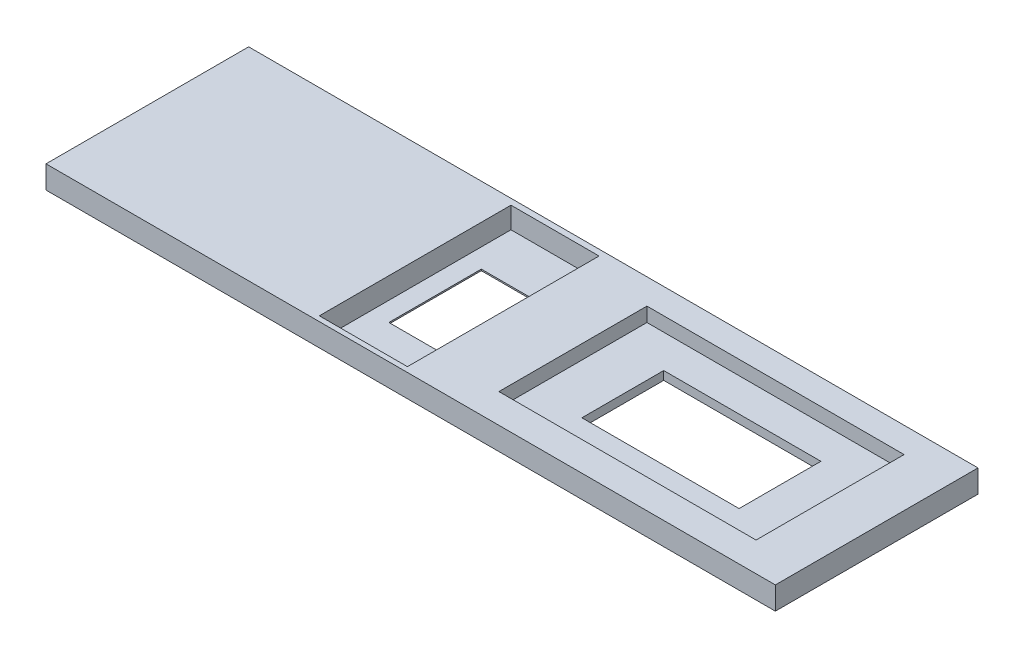
ISO-10303-21;
HEADER;
FILE_DESCRIPTION(('STEP AP214'),'2;1');
FILE_NAME('part.step','',(''),(''),'','','');
FILE_SCHEMA(('AUTOMOTIVE_DESIGN { 1 0 10303 214 1 1 1 1 }'));
ENDSEC;
DATA;
#1=APPLICATION_CONTEXT('core data for automotive mechanical design processes');
#2=APPLICATION_PROTOCOL_DEFINITION('international standard','automotive_design',2000,#1);
#3=PRODUCT_CONTEXT('',#1,'mechanical');
#4=PRODUCT('Part','Part','',(#3));
#5=PRODUCT_RELATED_PRODUCT_CATEGORY('part','',(#4));
#6=PRODUCT_DEFINITION_FORMATION('','',#4);
#7=PRODUCT_DEFINITION_CONTEXT('part definition',#1,'design');
#8=PRODUCT_DEFINITION('design','',#6,#7);
#9=PRODUCT_DEFINITION_SHAPE('','',#8);
#10=(LENGTH_UNIT() NAMED_UNIT(*) SI_UNIT(.MILLI.,.METRE.));
#11=(NAMED_UNIT(*) PLANE_ANGLE_UNIT() SI_UNIT($,.RADIAN.));
#12=(NAMED_UNIT(*) SI_UNIT($,.STERADIAN.) SOLID_ANGLE_UNIT());
#13=UNCERTAINTY_MEASURE_WITH_UNIT(LENGTH_MEASURE(1.E-05),#10,'distance_accuracy_value','');
#14=(GEOMETRIC_REPRESENTATION_CONTEXT(3) GLOBAL_UNCERTAINTY_ASSIGNED_CONTEXT((#13)) GLOBAL_UNIT_ASSIGNED_CONTEXT((#10,
#11,#12)) REPRESENTATION_CONTEXT('',''));
#15=CARTESIAN_POINT('',(0.,0.,0.));
#16=DIRECTION('',(0.,0.,1.));
#17=DIRECTION('',(1.,0.,0.));
#18=AXIS2_PLACEMENT_3D('',#15,#16,#17);
#19=CARTESIAN_POINT('',(0.,1.,0.));
#20=DIRECTION('',(0.,-1.,0.));
#21=DIRECTION('',(0.,0.,-1.));
#22=AXIS2_PLACEMENT_3D('',#19,#20,#21);
#23=PLANE('',#22);
#24=DIRECTION('',(-1.,0.,0.));
#25=VECTOR('',#24,1.);
#26=CARTESIAN_POINT('',(-5.82999999999999,1.,67.5299733079031));
#27=LINE('',#26,#25);
#28=CARTESIAN_POINT('',(-5.82999999999999,1.,67.5299733079031));
#29=VERTEX_POINT('',#28);
#30=CARTESIAN_POINT('',(-67.76,1.,67.5299733079031));
#31=VERTEX_POINT('',#30);
#32=EDGE_CURVE('E198',#29,#31,#27,.T.);
#33=ORIENTED_EDGE('',*,*,#32,.F.);
#34=DIRECTION('',(0.,0.,-1.));
#35=VECTOR('',#34,1.);
#36=CARTESIAN_POINT('',(-5.82999999999999,1.,67.5299733079031));
#37=LINE('',#36,#35);
#38=CARTESIAN_POINT('',(-5.82999999999999,1.,-67.2000266920968));
#39=VERTEX_POINT('',#38);
#40=EDGE_CURVE('E207',#29,#39,#37,.T.);
#41=ORIENTED_EDGE('',*,*,#40,.T.);
#42=DIRECTION('',(-1.,0.,0.));
#43=VECTOR('',#42,1.);
#44=CARTESIAN_POINT('',(-5.82999999999999,1.,-67.2000266920968));
#45=LINE('',#44,#43);
#46=CARTESIAN_POINT('',(-67.76,1.,-67.2000266920968));
#47=VERTEX_POINT('',#46);
#48=EDGE_CURVE('E204',#39,#47,#45,.T.);
#49=ORIENTED_EDGE('',*,*,#48,.T.);
#50=DIRECTION('',(0.,0.,-1.));
#51=VECTOR('',#50,1.);
#52=CARTESIAN_POINT('',(-67.76,1.,67.5299733079031));
#53=LINE('',#52,#51);
#54=EDGE_CURVE('E201',#31,#47,#53,.T.);
#55=ORIENTED_EDGE('',*,*,#54,.F.);
#56=EDGE_LOOP('',(#33,#41,#49,#55));
#57=FACE_BOUND('',#56,.T.);
#58=DIRECTION('',(0.,0.,-1.));
#59=VECTOR('',#58,1.);
#60=CARTESIAN_POINT('',(-19.26,1.,32.1507658849086));
#61=LINE('',#60,#59);
#62=CARTESIAN_POINT('',(-19.26,1.,32.1507658849086));
#63=VERTEX_POINT('',#62);
#64=CARTESIAN_POINT('',(-19.26,1.,-32.8492341150914));
#65=VERTEX_POINT('',#64);
#66=EDGE_CURVE('E181',#63,#65,#61,.T.);
#67=ORIENTED_EDGE('',*,*,#66,.F.);
#68=DIRECTION('',(1.,0.,0.));
#69=VECTOR('',#68,1.);
#70=CARTESIAN_POINT('',(-19.26,1.,32.1507658849086));
#71=LINE('',#70,#69);
#72=CARTESIAN_POINT('',(-54.26,1.,32.1507658849086));
#73=VERTEX_POINT('',#72);
#74=EDGE_CURVE('E178',#73,#63,#71,.T.);
#75=ORIENTED_EDGE('',*,*,#74,.F.);
#76=DIRECTION('',(0.,0.,1.));
#77=VECTOR('',#76,1.);
#78=CARTESIAN_POINT('',(-54.26,1.,32.1507658849086));
#79=LINE('',#78,#77);
#80=CARTESIAN_POINT('',(-54.26,1.,-32.8492341150914));
#81=VERTEX_POINT('',#80);
#82=EDGE_CURVE('E49',#81,#73,#79,.T.);
#83=ORIENTED_EDGE('',*,*,#82,.F.);
#84=DIRECTION('',(-1.,0.,0.));
#85=VECTOR('',#84,1.);
#86=CARTESIAN_POINT('',(-19.26,1.,-32.8492341150914));
#87=LINE('',#86,#85);
#88=EDGE_CURVE('E173',#65,#81,#87,.T.);
#89=ORIENTED_EDGE('',*,*,#88,.F.);
#90=EDGE_LOOP('',(#67,#75,#83,#89));
#91=FACE_BOUND('',#90,.T.);
#92=ADVANCED_FACE('F34',(#57,#91),#23,.F.);
#93=CARTESIAN_POINT('',(0.,16.,0.));
#94=DIRECTION('',(0.,-1.,0.));
#95=DIRECTION('',(0.,0.,-1.));
#96=AXIS2_PLACEMENT_3D('',#93,#94,#95);
#97=PLANE('',#96);
#98=DIRECTION('',(1.,0.,0.));
#99=VECTOR('',#98,1.);
#100=CARTESIAN_POINT('',(41.49,16.,-53.5399528951896));
#101=LINE('',#100,#99);
#102=CARTESIAN_POINT('',(41.49,16.,-53.5399528951896));
#103=VERTEX_POINT('',#102);
#104=CARTESIAN_POINT('',(222.3,16.,-53.5399528951896));
#105=VERTEX_POINT('',#104);
#106=EDGE_CURVE('E245',#103,#105,#101,.T.);
#107=ORIENTED_EDGE('',*,*,#106,.T.);
#108=DIRECTION('',(0.,0.,1.));
#109=VECTOR('',#108,1.);
#110=CARTESIAN_POINT('',(222.3,16.,-53.5399528951896));
#111=LINE('',#110,#109);
#112=CARTESIAN_POINT('',(222.3,16.,50.5400471048104));
#113=VERTEX_POINT('',#112);
#114=EDGE_CURVE('E268',#105,#113,#111,.T.);
#115=ORIENTED_EDGE('',*,*,#114,.T.);
#116=DIRECTION('',(1.,0.,0.));
#117=VECTOR('',#116,1.);
#118=CARTESIAN_POINT('',(41.49,16.,50.5400471048104));
#119=LINE('',#118,#117);
#120=CARTESIAN_POINT('',(41.49,16.,50.5400471048104));
#121=VERTEX_POINT('',#120);
#122=EDGE_CURVE('E271',#121,#113,#119,.T.);
#123=ORIENTED_EDGE('',*,*,#122,.F.);
#124=DIRECTION('',(0.,0.,1.));
#125=VECTOR('',#124,1.);
#126=CARTESIAN_POINT('',(41.49,16.,-53.5399528951896));
#127=LINE('',#126,#125);
#128=EDGE_CURVE('E257',#103,#121,#127,.T.);
#129=ORIENTED_EDGE('',*,*,#128,.F.);
#130=EDGE_LOOP('',(#107,#115,#123,#129));
#131=FACE_BOUND('',#130,.T.);
#132=DIRECTION('',(1.,0.,0.));
#133=VECTOR('',#132,1.);
#134=CARTESIAN_POINT('',(-256.4,16.,-71.4));
#135=LINE('',#134,#133);
#136=CARTESIAN_POINT('',(-256.4,16.,-71.4));
#137=VERTEX_POINT('',#136);
#138=CARTESIAN_POINT('',(256.4,16.,-71.4));
#139=VERTEX_POINT('',#138);
#140=EDGE_CURVE('E286',#137,#139,#135,.T.);
#141=ORIENTED_EDGE('',*,*,#140,.F.);
#142=DIRECTION('',(0.,0.,1.));
#143=VECTOR('',#142,1.);
#144=CARTESIAN_POINT('',(-256.4,16.,-71.4));
#145=LINE('',#144,#143);
#146=CARTESIAN_POINT('',(-256.4,16.,71.08));
#147=VERTEX_POINT('',#146);
#148=EDGE_CURVE('E295',#137,#147,#145,.T.);
#149=ORIENTED_EDGE('',*,*,#148,.T.);
#150=DIRECTION('',(1.,0.,0.));
#151=VECTOR('',#150,1.);
#152=CARTESIAN_POINT('',(-256.4,16.,71.08));
#153=LINE('',#152,#151);
#154=CARTESIAN_POINT('',(256.4,16.,71.08));
#155=VERTEX_POINT('',#154);
#156=EDGE_CURVE('E293',#147,#155,#153,.T.);
#157=ORIENTED_EDGE('',*,*,#156,.T.);
#158=DIRECTION('',(0.,0.,1.));
#159=VECTOR('',#158,1.);
#160=CARTESIAN_POINT('',(256.4,16.,-71.4));
#161=LINE('',#160,#159);
#162=EDGE_CURVE('E289',#139,#155,#161,.T.);
#163=ORIENTED_EDGE('',*,*,#162,.F.);
#164=EDGE_LOOP('',(#141,#149,#157,#163));
#165=FACE_BOUND('',#164,.T.);
#166=DIRECTION('',(-1.,0.,0.));
#167=VECTOR('',#166,1.);
#168=CARTESIAN_POINT('',(-5.82999999999999,16.,67.5299733079031));
#169=LINE('',#168,#167);
#170=CARTESIAN_POINT('',(-5.82999999999999,16.,67.5299733079031));
#171=VERTEX_POINT('',#170);
#172=CARTESIAN_POINT('',(-67.76,16.,67.5299733079031));
#173=VERTEX_POINT('',#172);
#174=EDGE_CURVE('E194',#171,#173,#169,.T.);
#175=ORIENTED_EDGE('',*,*,#174,.T.);
#176=DIRECTION('',(0.,0.,-1.));
#177=VECTOR('',#176,1.);
#178=CARTESIAN_POINT('',(-67.76,16.,67.5299733079031));
#179=LINE('',#178,#177);
#180=CARTESIAN_POINT('',(-67.76,16.,-67.2000266920968));
#181=VERTEX_POINT('',#180);
#182=EDGE_CURVE('E213',#173,#181,#179,.T.);
#183=ORIENTED_EDGE('',*,*,#182,.T.);
#184=DIRECTION('',(-1.,0.,0.));
#185=VECTOR('',#184,1.);
#186=CARTESIAN_POINT('',(-5.82999999999999,16.,-67.2000266920968));
#187=LINE('',#186,#185);
#188=CARTESIAN_POINT('',(-5.82999999999999,16.,-67.2000266920968));
#189=VERTEX_POINT('',#188);
#190=EDGE_CURVE('E216',#189,#181,#187,.T.);
#191=ORIENTED_EDGE('',*,*,#190,.F.);
#192=DIRECTION('',(0.,0.,-1.));
#193=VECTOR('',#192,1.);
#194=CARTESIAN_POINT('',(-5.82999999999999,16.,67.5299733079031));
#195=LINE('',#194,#193);
#196=EDGE_CURVE('E202',#171,#189,#195,.T.);
#197=ORIENTED_EDGE('',*,*,#196,.F.);
#198=EDGE_LOOP('',(#175,#183,#191,#197));
#199=FACE_BOUND('',#198,.T.);
#200=ADVANCED_FACE('F359',(#131,#165,#199),#97,.F.);
#201=CARTESIAN_POINT('',(-256.4,16.,-71.4));
#202=DIRECTION('',(0.,0.,-1.));
#203=DIRECTION('',(-1.,0.,0.));
#204=AXIS2_PLACEMENT_3D('',#201,#202,#203);
#205=PLANE('',#204);
#206=DIRECTION('',(1.,0.,0.));
#207=VECTOR('',#206,1.);
#208=CARTESIAN_POINT('',(-256.4,0.,-71.4));
#209=LINE('',#208,#207);
#210=CARTESIAN_POINT('',(-256.4,0.,-71.4));
#211=VERTEX_POINT('',#210);
#212=CARTESIAN_POINT('',(256.4,0.,-71.4));
#213=VERTEX_POINT('',#212);
#214=EDGE_CURVE('E285',#211,#213,#209,.T.);
#215=ORIENTED_EDGE('',*,*,#214,.F.);
#216=DIRECTION('',(0.,-1.,0.));
#217=VECTOR('',#216,1.);
#218=CARTESIAN_POINT('',(-256.4,16.,-71.4));
#219=LINE('',#218,#217);
#220=EDGE_CURVE('E307',#137,#211,#219,.T.);
#221=ORIENTED_EDGE('',*,*,#220,.F.);
#222=ORIENTED_EDGE('',*,*,#140,.T.);
#223=DIRECTION('',(0.,-1.,0.));
#224=VECTOR('',#223,1.);
#225=CARTESIAN_POINT('',(256.4,16.,-71.4));
#226=LINE('',#225,#224);
#227=EDGE_CURVE('E297',#139,#213,#226,.T.);
#228=ORIENTED_EDGE('',*,*,#227,.T.);
#229=EDGE_LOOP('',(#215,#221,#222,#228));
#230=FACE_BOUND('',#229,.T.);
#231=ADVANCED_FACE('F36',(#230),#205,.T.);
#232=CARTESIAN_POINT('',(-256.4,16.,-71.4));
#233=DIRECTION('',(1.,0.,0.));
#234=DIRECTION('',(0.,0.,-1.));
#235=AXIS2_PLACEMENT_3D('',#232,#233,#234);
#236=PLANE('',#235);
#237=DIRECTION('',(0.,0.,1.));
#238=VECTOR('',#237,1.);
#239=CARTESIAN_POINT('',(-256.4,0.,-71.4));
#240=LINE('',#239,#238);
#241=CARTESIAN_POINT('',(-256.4,0.,71.08));
#242=VERTEX_POINT('',#241);
#243=EDGE_CURVE('E290',#211,#242,#240,.T.);
#244=ORIENTED_EDGE('',*,*,#243,.T.);
#245=DIRECTION('',(0.,-1.,0.));
#246=VECTOR('',#245,1.);
#247=CARTESIAN_POINT('',(-256.4,16.,71.08));
#248=LINE('',#247,#246);
#249=EDGE_CURVE('E310',#147,#242,#248,.T.);
#250=ORIENTED_EDGE('',*,*,#249,.F.);
#251=ORIENTED_EDGE('',*,*,#148,.F.);
#252=ORIENTED_EDGE('',*,*,#220,.T.);
#253=EDGE_LOOP('',(#244,#250,#251,#252));
#254=FACE_BOUND('',#253,.T.);
#255=ADVANCED_FACE('F357',(#254),#236,.F.);
#256=CARTESIAN_POINT('',(-256.4,16.,71.08));
#257=DIRECTION('',(0.,0.,-1.));
#258=DIRECTION('',(-1.,0.,0.));
#259=AXIS2_PLACEMENT_3D('',#256,#257,#258);
#260=PLANE('',#259);
#261=DIRECTION('',(1.,0.,0.));
#262=VECTOR('',#261,1.);
#263=CARTESIAN_POINT('',(-256.4,0.,71.08));
#264=LINE('',#263,#262);
#265=CARTESIAN_POINT('',(256.4,0.,71.08));
#266=VERTEX_POINT('',#265);
#267=EDGE_CURVE('E303',#242,#266,#264,.T.);
#268=ORIENTED_EDGE('',*,*,#267,.T.);
#269=DIRECTION('',(0.,-1.,0.));
#270=VECTOR('',#269,1.);
#271=CARTESIAN_POINT('',(256.4,16.,71.08));
#272=LINE('',#271,#270);
#273=EDGE_CURVE('E313',#155,#266,#272,.T.);
#274=ORIENTED_EDGE('',*,*,#273,.F.);
#275=ORIENTED_EDGE('',*,*,#156,.F.);
#276=ORIENTED_EDGE('',*,*,#249,.T.);
#277=EDGE_LOOP('',(#268,#274,#275,#276));
#278=FACE_BOUND('',#277,.T.);
#279=ADVANCED_FACE('F354',(#278),#260,.F.);
#280=CARTESIAN_POINT('',(256.4,16.,-71.4));
#281=DIRECTION('',(1.,0.,0.));
#282=DIRECTION('',(0.,0.,-1.));
#283=AXIS2_PLACEMENT_3D('',#280,#281,#282);
#284=PLANE('',#283);
#285=DIRECTION('',(0.,0.,1.));
#286=VECTOR('',#285,1.);
#287=CARTESIAN_POINT('',(256.4,0.,-71.4));
#288=LINE('',#287,#286);
#289=EDGE_CURVE('E300',#213,#266,#288,.T.);
#290=ORIENTED_EDGE('',*,*,#289,.F.);
#291=ORIENTED_EDGE('',*,*,#227,.F.);
#292=ORIENTED_EDGE('',*,*,#162,.T.);
#293=ORIENTED_EDGE('',*,*,#273,.T.);
#294=EDGE_LOOP('',(#290,#291,#292,#293));
#295=FACE_BOUND('',#294,.T.);
#296=ADVANCED_FACE('F337',(#295),#284,.T.);
#297=CARTESIAN_POINT('',(0.,0.,0.));
#298=DIRECTION('',(0.,-1.,0.));
#299=DIRECTION('',(0.,0.,-1.));
#300=AXIS2_PLACEMENT_3D('',#297,#298,#299);
#301=PLANE('',#300);
#302=DIRECTION('',(0.,0.,1.));
#303=VECTOR('',#302,1.);
#304=CARTESIAN_POINT('',(-19.26,0.,0.));
#305=LINE('',#304,#303);
#306=CARTESIAN_POINT('',(-19.26,0.,-32.8492341150914));
#307=VERTEX_POINT('',#306);
#308=CARTESIAN_POINT('',(-19.26,0.,32.1507658849086));
#309=VERTEX_POINT('',#308);
#310=EDGE_CURVE('E11',#307,#309,#305,.T.);
#311=ORIENTED_EDGE('',*,*,#310,.F.);
#312=DIRECTION('',(1.,0.,0.));
#313=VECTOR('',#312,1.);
#314=CARTESIAN_POINT('',(0.,0.,-32.8492341150914));
#315=LINE('',#314,#313);
#316=CARTESIAN_POINT('',(-54.26,0.,-32.8492341150914));
#317=VERTEX_POINT('',#316);
#318=EDGE_CURVE('E175',#317,#307,#315,.T.);
#319=ORIENTED_EDGE('',*,*,#318,.F.);
#320=DIRECTION('',(0.,0.,-1.));
#321=VECTOR('',#320,1.);
#322=CARTESIAN_POINT('',(-54.26,0.,0.));
#323=LINE('',#322,#321);
#324=CARTESIAN_POINT('',(-54.26,0.,32.1507658849086));
#325=VERTEX_POINT('',#324);
#326=EDGE_CURVE('E326',#325,#317,#323,.T.);
#327=ORIENTED_EDGE('',*,*,#326,.F.);
#328=DIRECTION('',(-1.,0.,0.));
#329=VECTOR('',#328,1.);
#330=CARTESIAN_POINT('',(0.,0.,32.1507658849086));
#331=LINE('',#330,#329);
#332=EDGE_CURVE('E42',#309,#325,#331,.T.);
#333=ORIENTED_EDGE('',*,*,#332,.F.);
#334=EDGE_LOOP('',(#311,#319,#327,#333));
#335=FACE_BOUND('',#334,.T.);
#336=DIRECTION('',(0.,0.,1.));
#337=VECTOR('',#336,1.);
#338=CARTESIAN_POINT('',(76.625,0.,-30.1999528951896));
#339=LINE('',#338,#337);
#340=CARTESIAN_POINT('',(76.625,0.,-30.1999528951896));
#341=VERTEX_POINT('',#340);
#342=CARTESIAN_POINT('',(76.625,0.,27.3400471048104));
#343=VERTEX_POINT('',#342);
#344=EDGE_CURVE('E230',#341,#343,#339,.T.);
#345=ORIENTED_EDGE('',*,*,#344,.T.);
#346=DIRECTION('',(1.,0.,0.));
#347=VECTOR('',#346,1.);
#348=CARTESIAN_POINT('',(76.625,0.,27.3400471048104));
#349=LINE('',#348,#347);
#350=CARTESIAN_POINT('',(187.165,0.,27.3400471048104));
#351=VERTEX_POINT('',#350);
#352=EDGE_CURVE('E233',#343,#351,#349,.T.);
#353=ORIENTED_EDGE('',*,*,#352,.T.);
#354=DIRECTION('',(0.,0.,1.));
#355=VECTOR('',#354,1.);
#356=CARTESIAN_POINT('',(187.165,0.,-30.1999528951896));
#357=LINE('',#356,#355);
#358=CARTESIAN_POINT('',(187.165,0.,-30.1999528951896));
#359=VERTEX_POINT('',#358);
#360=EDGE_CURVE('E236',#359,#351,#357,.T.);
#361=ORIENTED_EDGE('',*,*,#360,.F.);
#362=DIRECTION('',(1.,0.,0.));
#363=VECTOR('',#362,1.);
#364=CARTESIAN_POINT('',(76.625,0.,-30.1999528951896));
#365=LINE('',#364,#363);
#366=EDGE_CURVE('E239',#341,#359,#365,.T.);
#367=ORIENTED_EDGE('',*,*,#366,.F.);
#368=EDGE_LOOP('',(#345,#353,#361,#367));
#369=FACE_BOUND('',#368,.T.);
#370=ORIENTED_EDGE('',*,*,#214,.T.);
#371=ORIENTED_EDGE('',*,*,#289,.T.);
#372=ORIENTED_EDGE('',*,*,#267,.F.);
#373=ORIENTED_EDGE('',*,*,#243,.F.);
#374=EDGE_LOOP('',(#370,#371,#372,#373));
#375=FACE_BOUND('',#374,.T.);
#376=ADVANCED_FACE('F333',(#335,#369,#375),#301,.T.);
#377=CARTESIAN_POINT('',(41.49,6.,-53.5399528951896));
#378=DIRECTION('',(0.,0.,1.));
#379=DIRECTION('',(1.,0.,0.));
#380=AXIS2_PLACEMENT_3D('',#377,#378,#379);
#381=PLANE('',#380);
#382=ORIENTED_EDGE('',*,*,#106,.F.);
#383=DIRECTION('',(0.,1.,0.));
#384=VECTOR('',#383,1.);
#385=CARTESIAN_POINT('',(41.49,6.,-53.5399528951896));
#386=LINE('',#385,#384);
#387=CARTESIAN_POINT('',(41.49,6.,-53.5399528951896));
#388=VERTEX_POINT('',#387);
#389=EDGE_CURVE('E265',#388,#103,#386,.T.);
#390=ORIENTED_EDGE('',*,*,#389,.F.);
#391=DIRECTION('',(1.,0.,0.));
#392=VECTOR('',#391,1.);
#393=CARTESIAN_POINT('',(41.49,6.,-53.5399528951896));
#394=LINE('',#393,#392);
#395=CARTESIAN_POINT('',(222.3,6.,-53.5399528951896));
#396=VERTEX_POINT('',#395);
#397=EDGE_CURVE('E253',#388,#396,#394,.T.);
#398=ORIENTED_EDGE('',*,*,#397,.T.);
#399=DIRECTION('',(0.,1.,0.));
#400=VECTOR('',#399,1.);
#401=CARTESIAN_POINT('',(222.3,6.,-53.5399528951896));
#402=LINE('',#401,#400);
#403=EDGE_CURVE('E282',#396,#105,#402,.T.);
#404=ORIENTED_EDGE('',*,*,#403,.T.);
#405=EDGE_LOOP('',(#382,#390,#398,#404));
#406=FACE_BOUND('',#405,.T.);
#407=ADVANCED_FACE('F336',(#406),#381,.T.);
#408=CARTESIAN_POINT('',(222.3,6.,-53.5399528951896));
#409=DIRECTION('',(-1.,0.,0.));
#410=DIRECTION('',(0.,0.,1.));
#411=AXIS2_PLACEMENT_3D('',#408,#409,#410);
#412=PLANE('',#411);
#413=ORIENTED_EDGE('',*,*,#114,.F.);
#414=ORIENTED_EDGE('',*,*,#403,.F.);
#415=DIRECTION('',(0.,0.,1.));
#416=VECTOR('',#415,1.);
#417=CARTESIAN_POINT('',(222.3,6.,-53.5399528951896));
#418=LINE('',#417,#416);
#419=CARTESIAN_POINT('',(222.3,6.,50.5400471048104));
#420=VERTEX_POINT('',#419);
#421=EDGE_CURVE('E256',#396,#420,#418,.T.);
#422=ORIENTED_EDGE('',*,*,#421,.T.);
#423=DIRECTION('',(0.,1.,0.));
#424=VECTOR('',#423,1.);
#425=CARTESIAN_POINT('',(222.3,6.,50.5400471048104));
#426=LINE('',#425,#424);
#427=EDGE_CURVE('E280',#420,#113,#426,.T.);
#428=ORIENTED_EDGE('',*,*,#427,.T.);
#429=EDGE_LOOP('',(#413,#414,#422,#428));
#430=FACE_BOUND('',#429,.T.);
#431=ADVANCED_FACE('F516',(#430),#412,.T.);
#432=CARTESIAN_POINT('',(41.49,6.,50.5400471048104));
#433=DIRECTION('',(0.,0.,1.));
#434=DIRECTION('',(1.,0.,0.));
#435=AXIS2_PLACEMENT_3D('',#432,#433,#434);
#436=PLANE('',#435);
#437=ORIENTED_EDGE('',*,*,#122,.T.);
#438=ORIENTED_EDGE('',*,*,#427,.F.);
#439=DIRECTION('',(1.,0.,0.));
#440=VECTOR('',#439,1.);
#441=CARTESIAN_POINT('',(41.49,6.,50.5400471048104));
#442=LINE('',#441,#440);
#443=CARTESIAN_POINT('',(41.49,6.,50.5400471048104));
#444=VERTEX_POINT('',#443);
#445=EDGE_CURVE('E259',#444,#420,#442,.T.);
#446=ORIENTED_EDGE('',*,*,#445,.F.);
#447=DIRECTION('',(0.,1.,0.));
#448=VECTOR('',#447,1.);
#449=CARTESIAN_POINT('',(41.49,6.,50.5400471048104));
#450=LINE('',#449,#448);
#451=EDGE_CURVE('E278',#444,#121,#450,.T.);
#452=ORIENTED_EDGE('',*,*,#451,.T.);
#453=EDGE_LOOP('',(#437,#438,#446,#452));
#454=FACE_BOUND('',#453,.T.);
#455=ADVANCED_FACE('F507',(#454),#436,.F.);
#456=CARTESIAN_POINT('',(41.49,6.,-53.5399528951896));
#457=DIRECTION('',(-1.,0.,0.));
#458=DIRECTION('',(0.,0.,1.));
#459=AXIS2_PLACEMENT_3D('',#456,#457,#458);
#460=PLANE('',#459);
#461=ORIENTED_EDGE('',*,*,#128,.T.);
#462=ORIENTED_EDGE('',*,*,#451,.F.);
#463=DIRECTION('',(0.,0.,1.));
#464=VECTOR('',#463,1.);
#465=CARTESIAN_POINT('',(41.49,6.,-53.5399528951896));
#466=LINE('',#465,#464);
#467=EDGE_CURVE('E262',#388,#444,#466,.T.);
#468=ORIENTED_EDGE('',*,*,#467,.F.);
#469=ORIENTED_EDGE('',*,*,#389,.T.);
#470=EDGE_LOOP('',(#461,#462,#468,#469));
#471=FACE_BOUND('',#470,.T.);
#472=ADVANCED_FACE('F498',(#471),#460,.F.);
#473=CARTESIAN_POINT('',(0.,6.,0.));
#474=DIRECTION('',(0.,-1.,0.));
#475=DIRECTION('',(0.,0.,-1.));
#476=AXIS2_PLACEMENT_3D('',#473,#474,#475);
#477=PLANE('',#476);
#478=DIRECTION('',(-1.,0.,0.));
#479=VECTOR('',#478,1.);
#480=CARTESIAN_POINT('',(0.,6.,27.3400471048104));
#481=LINE('',#480,#479);
#482=CARTESIAN_POINT('',(187.165,6.,27.3400471048104));
#483=VERTEX_POINT('',#482);
#484=CARTESIAN_POINT('',(76.625,6.,27.3400471048104));
#485=VERTEX_POINT('',#484);
#486=EDGE_CURVE('E309',#483,#485,#481,.T.);
#487=ORIENTED_EDGE('',*,*,#486,.T.);
#488=DIRECTION('',(0.,0.,-1.));
#489=VECTOR('',#488,1.);
#490=CARTESIAN_POINT('',(76.625,6.,0.));
#491=LINE('',#490,#489);
#492=CARTESIAN_POINT('',(76.625,6.,-30.1999528951896));
#493=VERTEX_POINT('',#492);
#494=EDGE_CURVE('E322',#485,#493,#491,.T.);
#495=ORIENTED_EDGE('',*,*,#494,.T.);
#496=DIRECTION('',(-1.,0.,0.));
#497=VECTOR('',#496,1.);
#498=CARTESIAN_POINT('',(0.,6.,-30.1999528951896));
#499=LINE('',#498,#497);
#500=CARTESIAN_POINT('',(187.165,6.,-30.1999528951896));
#501=VERTEX_POINT('',#500);
#502=EDGE_CURVE('E320',#501,#493,#499,.T.);
#503=ORIENTED_EDGE('',*,*,#502,.F.);
#504=DIRECTION('',(0.,0.,-1.));
#505=VECTOR('',#504,1.);
#506=CARTESIAN_POINT('',(187.165,6.,0.));
#507=LINE('',#506,#505);
#508=EDGE_CURVE('E318',#483,#501,#507,.T.);
#509=ORIENTED_EDGE('',*,*,#508,.F.);
#510=EDGE_LOOP('',(#487,#495,#503,#509));
#511=FACE_BOUND('',#510,.T.);
#512=ORIENTED_EDGE('',*,*,#397,.F.);
#513=ORIENTED_EDGE('',*,*,#467,.T.);
#514=ORIENTED_EDGE('',*,*,#445,.T.);
#515=ORIENTED_EDGE('',*,*,#421,.F.);
#516=EDGE_LOOP('',(#512,#513,#514,#515));
#517=FACE_BOUND('',#516,.T.);
#518=ADVANCED_FACE('F489',(#511,#517),#477,.F.);
#519=CARTESIAN_POINT('',(76.625,0.,-30.1999528951896));
#520=DIRECTION('',(-1.,0.,0.));
#521=DIRECTION('',(0.,0.,1.));
#522=AXIS2_PLACEMENT_3D('',#519,#520,#521);
#523=PLANE('',#522);
#524=DIRECTION('',(0.,1.,0.));
#525=VECTOR('',#524,1.);
#526=CARTESIAN_POINT('',(76.625,0.,27.3400471048104));
#527=LINE('',#526,#525);
#528=EDGE_CURVE('E241',#343,#485,#527,.T.);
#529=ORIENTED_EDGE('',*,*,#528,.F.);
#530=ORIENTED_EDGE('',*,*,#344,.F.);
#531=DIRECTION('',(0.,1.,0.));
#532=VECTOR('',#531,1.);
#533=CARTESIAN_POINT('',(76.625,0.,-30.1999528951896));
#534=LINE('',#533,#532);
#535=EDGE_CURVE('E242',#341,#493,#534,.T.);
#536=ORIENTED_EDGE('',*,*,#535,.T.);
#537=ORIENTED_EDGE('',*,*,#494,.F.);
#538=EDGE_LOOP('',(#529,#530,#536,#537));
#539=FACE_BOUND('',#538,.T.);
#540=ADVANCED_FACE('F480',(#539),#523,.F.);
#541=CARTESIAN_POINT('',(76.625,0.,-30.1999528951896));
#542=DIRECTION('',(0.,0.,1.));
#543=DIRECTION('',(1.,0.,0.));
#544=AXIS2_PLACEMENT_3D('',#541,#542,#543);
#545=PLANE('',#544);
#546=ORIENTED_EDGE('',*,*,#502,.T.);
#547=ORIENTED_EDGE('',*,*,#535,.F.);
#548=ORIENTED_EDGE('',*,*,#366,.T.);
#549=DIRECTION('',(0.,1.,0.));
#550=VECTOR('',#549,1.);
#551=CARTESIAN_POINT('',(187.165,0.,-30.1999528951896));
#552=LINE('',#551,#550);
#553=EDGE_CURVE('E246',#359,#501,#552,.T.);
#554=ORIENTED_EDGE('',*,*,#553,.T.);
#555=EDGE_LOOP('',(#546,#547,#548,#554));
#556=FACE_BOUND('',#555,.T.);
#557=ADVANCED_FACE('F471',(#556),#545,.T.);
#558=CARTESIAN_POINT('',(187.165,0.,-30.1999528951896));
#559=DIRECTION('',(-1.,0.,0.));
#560=DIRECTION('',(0.,0.,1.));
#561=AXIS2_PLACEMENT_3D('',#558,#559,#560);
#562=PLANE('',#561);
#563=ORIENTED_EDGE('',*,*,#508,.T.);
#564=ORIENTED_EDGE('',*,*,#553,.F.);
#565=ORIENTED_EDGE('',*,*,#360,.T.);
#566=DIRECTION('',(0.,1.,0.));
#567=VECTOR('',#566,1.);
#568=CARTESIAN_POINT('',(187.165,0.,27.3400471048104));
#569=LINE('',#568,#567);
#570=EDGE_CURVE('E249',#351,#483,#569,.T.);
#571=ORIENTED_EDGE('',*,*,#570,.T.);
#572=EDGE_LOOP('',(#563,#564,#565,#571));
#573=FACE_BOUND('',#572,.T.);
#574=ADVANCED_FACE('F462',(#573),#562,.T.);
#575=CARTESIAN_POINT('',(76.625,0.,27.3400471048104));
#576=DIRECTION('',(0.,0.,1.));
#577=DIRECTION('',(1.,0.,0.));
#578=AXIS2_PLACEMENT_3D('',#575,#576,#577);
#579=PLANE('',#578);
#580=ORIENTED_EDGE('',*,*,#570,.F.);
#581=ORIENTED_EDGE('',*,*,#352,.F.);
#582=ORIENTED_EDGE('',*,*,#528,.T.);
#583=ORIENTED_EDGE('',*,*,#486,.F.);
#584=EDGE_LOOP('',(#580,#581,#582,#583));
#585=FACE_BOUND('',#584,.T.);
#586=ADVANCED_FACE('F449',(#585),#579,.F.);
#587=CARTESIAN_POINT('',(-5.82999999999999,1.,67.5299733079031));
#588=DIRECTION('',(0.,0.,-1.));
#589=DIRECTION('',(-1.,0.,0.));
#590=AXIS2_PLACEMENT_3D('',#587,#588,#589);
#591=PLANE('',#590);
#592=ORIENTED_EDGE('',*,*,#174,.F.);
#593=DIRECTION('',(0.,1.,0.));
#594=VECTOR('',#593,1.);
#595=CARTESIAN_POINT('',(-5.82999999999999,1.,67.5299733079031));
#596=LINE('',#595,#594);
#597=EDGE_CURVE('E210',#29,#171,#596,.T.);
#598=ORIENTED_EDGE('',*,*,#597,.F.);
#599=ORIENTED_EDGE('',*,*,#32,.T.);
#600=DIRECTION('',(0.,1.,0.));
#601=VECTOR('',#600,1.);
#602=CARTESIAN_POINT('',(-67.76,1.,67.5299733079031));
#603=LINE('',#602,#601);
#604=EDGE_CURVE('E227',#31,#173,#603,.T.);
#605=ORIENTED_EDGE('',*,*,#604,.T.);
#606=EDGE_LOOP('',(#592,#598,#599,#605));
#607=FACE_BOUND('',#606,.T.);
#608=ADVANCED_FACE('F367',(#607),#591,.T.);
#609=CARTESIAN_POINT('',(-67.76,1.,67.5299733079031));
#610=DIRECTION('',(1.,0.,0.));
#611=DIRECTION('',(0.,0.,-1.));
#612=AXIS2_PLACEMENT_3D('',#609,#610,#611);
#613=PLANE('',#612);
#614=ORIENTED_EDGE('',*,*,#182,.F.);
#615=ORIENTED_EDGE('',*,*,#604,.F.);
#616=ORIENTED_EDGE('',*,*,#54,.T.);
#617=DIRECTION('',(0.,1.,0.));
#618=VECTOR('',#617,1.);
#619=CARTESIAN_POINT('',(-67.76,1.,-67.2000266920968));
#620=LINE('',#619,#618);
#621=EDGE_CURVE('E225',#47,#181,#620,.T.);
#622=ORIENTED_EDGE('',*,*,#621,.T.);
#623=EDGE_LOOP('',(#614,#615,#616,#622));
#624=FACE_BOUND('',#623,.T.);
#625=ADVANCED_FACE('F376',(#624),#613,.T.);
#626=CARTESIAN_POINT('',(-5.82999999999999,1.,-67.2000266920968));
#627=DIRECTION('',(0.,0.,-1.));
#628=DIRECTION('',(-1.,0.,0.));
#629=AXIS2_PLACEMENT_3D('',#626,#627,#628);
#630=PLANE('',#629);
#631=ORIENTED_EDGE('',*,*,#190,.T.);
#632=ORIENTED_EDGE('',*,*,#621,.F.);
#633=ORIENTED_EDGE('',*,*,#48,.F.);
#634=DIRECTION('',(0.,1.,0.));
#635=VECTOR('',#634,1.);
#636=CARTESIAN_POINT('',(-5.82999999999999,1.,-67.2000266920968));
#637=LINE('',#636,#635);
#638=EDGE_CURVE('E223',#39,#189,#637,.T.);
#639=ORIENTED_EDGE('',*,*,#638,.T.);
#640=EDGE_LOOP('',(#631,#632,#633,#639));
#641=FACE_BOUND('',#640,.T.);
#642=ADVANCED_FACE('F379',(#641),#630,.F.);
#643=CARTESIAN_POINT('',(-5.82999999999999,1.,67.5299733079031));
#644=DIRECTION('',(1.,0.,0.));
#645=DIRECTION('',(0.,0.,-1.));
#646=AXIS2_PLACEMENT_3D('',#643,#644,#645);
#647=PLANE('',#646);
#648=ORIENTED_EDGE('',*,*,#196,.T.);
#649=ORIENTED_EDGE('',*,*,#638,.F.);
#650=ORIENTED_EDGE('',*,*,#40,.F.);
#651=ORIENTED_EDGE('',*,*,#597,.T.);
#652=EDGE_LOOP('',(#648,#649,#650,#651));
#653=FACE_BOUND('',#652,.T.);
#654=ADVANCED_FACE('F372',(#653),#647,.F.);
#655=CARTESIAN_POINT('',(-19.26,-4.,32.1507658849086));
#656=DIRECTION('',(1.,0.,0.));
#657=DIRECTION('',(0.,0.,-1.));
#658=AXIS2_PLACEMENT_3D('',#655,#656,#657);
#659=PLANE('',#658);
#660=ORIENTED_EDGE('',*,*,#310,.T.);
#661=DIRECTION('',(0.,1.,0.));
#662=VECTOR('',#661,1.);
#663=CARTESIAN_POINT('',(-19.26,-4.,32.1507658849086));
#664=LINE('',#663,#662);
#665=EDGE_CURVE('E184',#309,#63,#664,.T.);
#666=ORIENTED_EDGE('',*,*,#665,.T.);
#667=ORIENTED_EDGE('',*,*,#66,.T.);
#668=DIRECTION('',(0.,1.,0.));
#669=VECTOR('',#668,1.);
#670=CARTESIAN_POINT('',(-19.26,-4.,-32.8492341150914));
#671=LINE('',#670,#669);
#672=EDGE_CURVE('E169',#307,#65,#671,.T.);
#673=ORIENTED_EDGE('',*,*,#672,.F.);
#674=EDGE_LOOP('',(#660,#666,#667,#673));
#675=FACE_BOUND('',#674,.T.);
#676=ADVANCED_FACE('F182',(#675),#659,.F.);
#677=CARTESIAN_POINT('',(-19.26,-4.,32.1507658849086));
#678=DIRECTION('',(0.,0.,1.));
#679=DIRECTION('',(1.,0.,0.));
#680=AXIS2_PLACEMENT_3D('',#677,#678,#679);
#681=PLANE('',#680);
#682=ORIENTED_EDGE('',*,*,#332,.T.);
#683=DIRECTION('',(0.,1.,0.));
#684=VECTOR('',#683,1.);
#685=CARTESIAN_POINT('',(-54.26,-4.,32.1507658849086));
#686=LINE('',#685,#684);
#687=EDGE_CURVE('E195',#325,#73,#686,.T.);
#688=ORIENTED_EDGE('',*,*,#687,.T.);
#689=ORIENTED_EDGE('',*,*,#74,.T.);
#690=ORIENTED_EDGE('',*,*,#665,.F.);
#691=EDGE_LOOP('',(#682,#688,#689,#690));
#692=FACE_BOUND('',#691,.T.);
#693=ADVANCED_FACE('F329',(#692),#681,.F.);
#694=CARTESIAN_POINT('',(-54.26,-4.,32.1507658849086));
#695=DIRECTION('',(-1.,0.,0.));
#696=DIRECTION('',(0.,0.,1.));
#697=AXIS2_PLACEMENT_3D('',#694,#695,#696);
#698=PLANE('',#697);
#699=ORIENTED_EDGE('',*,*,#326,.T.);
#700=DIRECTION('',(0.,1.,0.));
#701=VECTOR('',#700,1.);
#702=CARTESIAN_POINT('',(-54.26,-4.,-32.8492341150914));
#703=LINE('',#702,#701);
#704=EDGE_CURVE('E56',#317,#81,#703,.T.);
#705=ORIENTED_EDGE('',*,*,#704,.T.);
#706=ORIENTED_EDGE('',*,*,#82,.T.);
#707=ORIENTED_EDGE('',*,*,#687,.F.);
#708=EDGE_LOOP('',(#699,#705,#706,#707));
#709=FACE_BOUND('',#708,.T.);
#710=ADVANCED_FACE('F332',(#709),#698,.F.);
#711=CARTESIAN_POINT('',(-19.26,-4.,-32.8492341150914));
#712=DIRECTION('',(0.,0.,-1.));
#713=DIRECTION('',(-1.,0.,0.));
#714=AXIS2_PLACEMENT_3D('',#711,#712,#713);
#715=PLANE('',#714);
#716=ORIENTED_EDGE('',*,*,#318,.T.);
#717=ORIENTED_EDGE('',*,*,#672,.T.);
#718=ORIENTED_EDGE('',*,*,#88,.T.);
#719=ORIENTED_EDGE('',*,*,#704,.F.);
#720=EDGE_LOOP('',(#716,#717,#718,#719));
#721=FACE_BOUND('',#720,.T.);
#722=ADVANCED_FACE('F171',(#721),#715,.F.);
#723=CLOSED_SHELL('',(#92,#200,#231,#255,#279,#296,#376,#407,#431,#455,#472,#518,#540,#557,#574,
#586,#608,#625,#642,#654,#676,#693,#710,#722));
#724=MANIFOLD_SOLID_BREP('B2',#723);
#725=ADVANCED_BREP_SHAPE_REPRESENTATION('',(#18,#724),#14);
#726=SHAPE_DEFINITION_REPRESENTATION(#9,#725);
ENDSEC;
END-ISO-10303-21;
